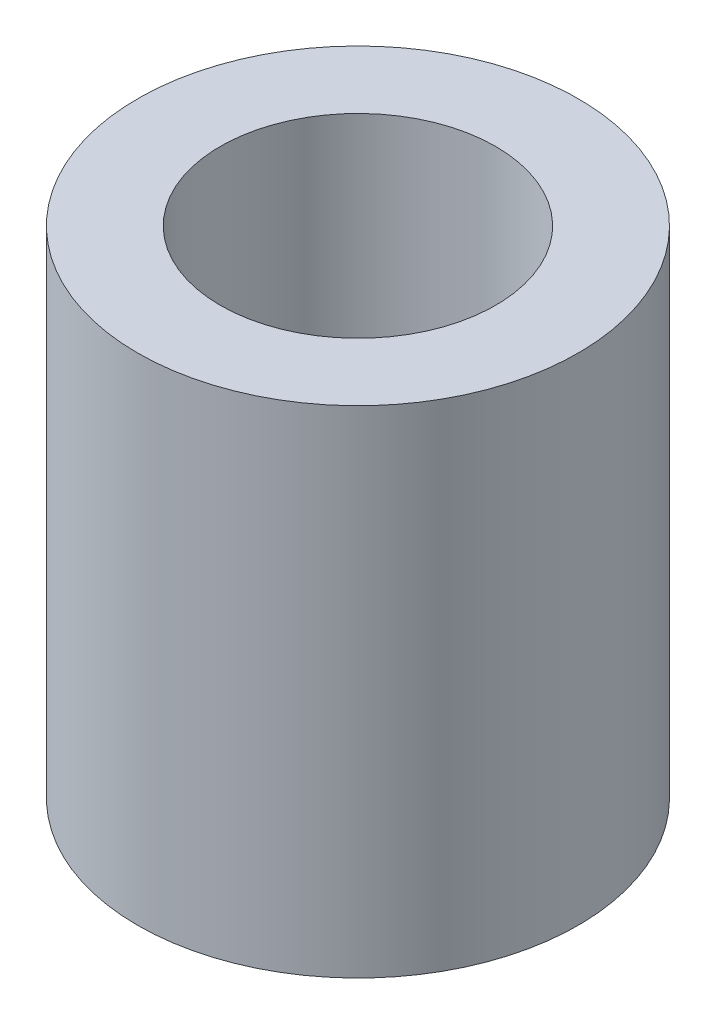
ISO-10303-21;
HEADER;
FILE_DESCRIPTION(('STEP AP214'),'2;1');
FILE_NAME('part.step','',(''),(''),'','','');
FILE_SCHEMA(('AUTOMOTIVE_DESIGN { 1 0 10303 214 1 1 1 1 }'));
ENDSEC;
DATA;
#1=APPLICATION_CONTEXT('core data for automotive mechanical design processes');
#2=APPLICATION_PROTOCOL_DEFINITION('international standard','automotive_design',2000,#1);
#3=PRODUCT_CONTEXT('',#1,'mechanical');
#4=PRODUCT('Part','Part','',(#3));
#5=PRODUCT_RELATED_PRODUCT_CATEGORY('part','',(#4));
#6=PRODUCT_DEFINITION_FORMATION('','',#4);
#7=PRODUCT_DEFINITION_CONTEXT('part definition',#1,'design');
#8=PRODUCT_DEFINITION('design','',#6,#7);
#9=PRODUCT_DEFINITION_SHAPE('','',#8);
#10=(LENGTH_UNIT() NAMED_UNIT(*) SI_UNIT(.MILLI.,.METRE.));
#11=(NAMED_UNIT(*) PLANE_ANGLE_UNIT() SI_UNIT($,.RADIAN.));
#12=(NAMED_UNIT(*) SI_UNIT($,.STERADIAN.) SOLID_ANGLE_UNIT());
#13=UNCERTAINTY_MEASURE_WITH_UNIT(LENGTH_MEASURE(1.E-05),#10,'distance_accuracy_value','');
#14=(GEOMETRIC_REPRESENTATION_CONTEXT(3) GLOBAL_UNCERTAINTY_ASSIGNED_CONTEXT((#13)) GLOBAL_UNIT_ASSIGNED_CONTEXT((#10,
#11,#12)) REPRESENTATION_CONTEXT('',''));
#15=CARTESIAN_POINT('',(0.,0.,0.));
#16=DIRECTION('',(0.,0.,1.));
#17=DIRECTION('',(1.,0.,0.));
#18=AXIS2_PLACEMENT_3D('',#15,#16,#17);
#19=CARTESIAN_POINT('',(0.,9.,0.));
#20=DIRECTION('',(0.,1.,0.));
#21=DIRECTION('',(0.,0.,1.));
#22=AXIS2_PLACEMENT_3D('',#19,#20,#21);
#23=PLANE('',#22);
#24=CARTESIAN_POINT('',(0.,9.,0.));
#25=DIRECTION('',(0.,1.,0.));
#26=DIRECTION('',(0.,0.,1.));
#27=AXIS2_PLACEMENT_3D('',#24,#25,#26);
#28=CIRCLE('',#27,4.);
#29=CARTESIAN_POINT('',(0.,9.,4.));
#30=VERTEX_POINT('',#29);
#31=EDGE_CURVE('E10',#30,#30,#28,.T.);
#32=ORIENTED_EDGE('',*,*,#31,.T.);
#33=EDGE_LOOP('',(#32));
#34=FACE_BOUND('',#33,.T.);
#35=CARTESIAN_POINT('',(0.,9.,0.));
#36=DIRECTION('',(0.,1.,0.));
#37=DIRECTION('',(0.,0.,1.));
#38=AXIS2_PLACEMENT_3D('',#35,#36,#37);
#39=CIRCLE('',#38,2.5);
#40=CARTESIAN_POINT('',(0.,9.,2.5));
#41=VERTEX_POINT('',#40);
#42=EDGE_CURVE('E42',#41,#41,#39,.T.);
#43=ORIENTED_EDGE('',*,*,#42,.F.);
#44=EDGE_LOOP('',(#43));
#45=FACE_BOUND('',#44,.T.);
#46=ADVANCED_FACE('F31',(#34,#45),#23,.T.);
#47=CARTESIAN_POINT('',(0.,0.,0.));
#48=DIRECTION('',(0.,1.,0.));
#49=DIRECTION('',(0.,0.,1.));
#50=AXIS2_PLACEMENT_3D('',#47,#48,#49);
#51=PLANE('',#50);
#52=CARTESIAN_POINT('',(0.,0.,0.));
#53=DIRECTION('',(0.,1.,0.));
#54=DIRECTION('',(0.,0.,1.));
#55=AXIS2_PLACEMENT_3D('',#52,#53,#54);
#56=CIRCLE('',#55,4.);
#57=CARTESIAN_POINT('',(0.,0.,4.));
#58=VERTEX_POINT('',#57);
#59=EDGE_CURVE('E35',#58,#58,#56,.T.);
#60=ORIENTED_EDGE('',*,*,#59,.F.);
#61=EDGE_LOOP('',(#60));
#62=FACE_BOUND('',#61,.T.);
#63=CARTESIAN_POINT('',(0.,0.,0.));
#64=DIRECTION('',(0.,1.,0.));
#65=DIRECTION('',(0.,0.,1.));
#66=AXIS2_PLACEMENT_3D('',#63,#64,#65);
#67=CIRCLE('',#66,2.5);
#68=CARTESIAN_POINT('',(0.,0.,2.5));
#69=VERTEX_POINT('',#68);
#70=EDGE_CURVE('E44',#69,#69,#67,.T.);
#71=ORIENTED_EDGE('',*,*,#70,.T.);
#72=EDGE_LOOP('',(#71));
#73=FACE_BOUND('',#72,.T.);
#74=ADVANCED_FACE('F54',(#62,#73),#51,.F.);
#75=CARTESIAN_POINT('',(0.,9.,0.));
#76=DIRECTION('',(0.,-1.,0.));
#77=DIRECTION('',(0.,0.,-1.));
#78=AXIS2_PLACEMENT_3D('',#75,#76,#77);
#79=CYLINDRICAL_SURFACE('',#78,4.);
#80=ORIENTED_EDGE('',*,*,#31,.F.);
#81=EDGE_LOOP('',(#80));
#82=FACE_BOUND('',#81,.T.);
#83=ORIENTED_EDGE('',*,*,#59,.T.);
#84=EDGE_LOOP('',(#83));
#85=FACE_BOUND('',#84,.T.);
#86=ADVANCED_FACE('F33',(#82,#85),#79,.T.);
#87=CARTESIAN_POINT('',(0.,9.,0.));
#88=DIRECTION('',(0.,-1.,0.));
#89=DIRECTION('',(0.,0.,-1.));
#90=AXIS2_PLACEMENT_3D('',#87,#88,#89);
#91=CYLINDRICAL_SURFACE('',#90,2.5);
#92=ORIENTED_EDGE('',*,*,#42,.T.);
#93=EDGE_LOOP('',(#92));
#94=FACE_BOUND('',#93,.T.);
#95=ORIENTED_EDGE('',*,*,#70,.F.);
#96=EDGE_LOOP('',(#95));
#97=FACE_BOUND('',#96,.T.);
#98=ADVANCED_FACE('F50',(#94,#97),#91,.F.);
#99=CLOSED_SHELL('',(#46,#74,#86,#98));
#100=MANIFOLD_SOLID_BREP('B2',#99);
#101=ADVANCED_BREP_SHAPE_REPRESENTATION('',(#18,#100),#14);
#102=SHAPE_DEFINITION_REPRESENTATION(#9,#101);
ENDSEC;
END-ISO-10303-21;
